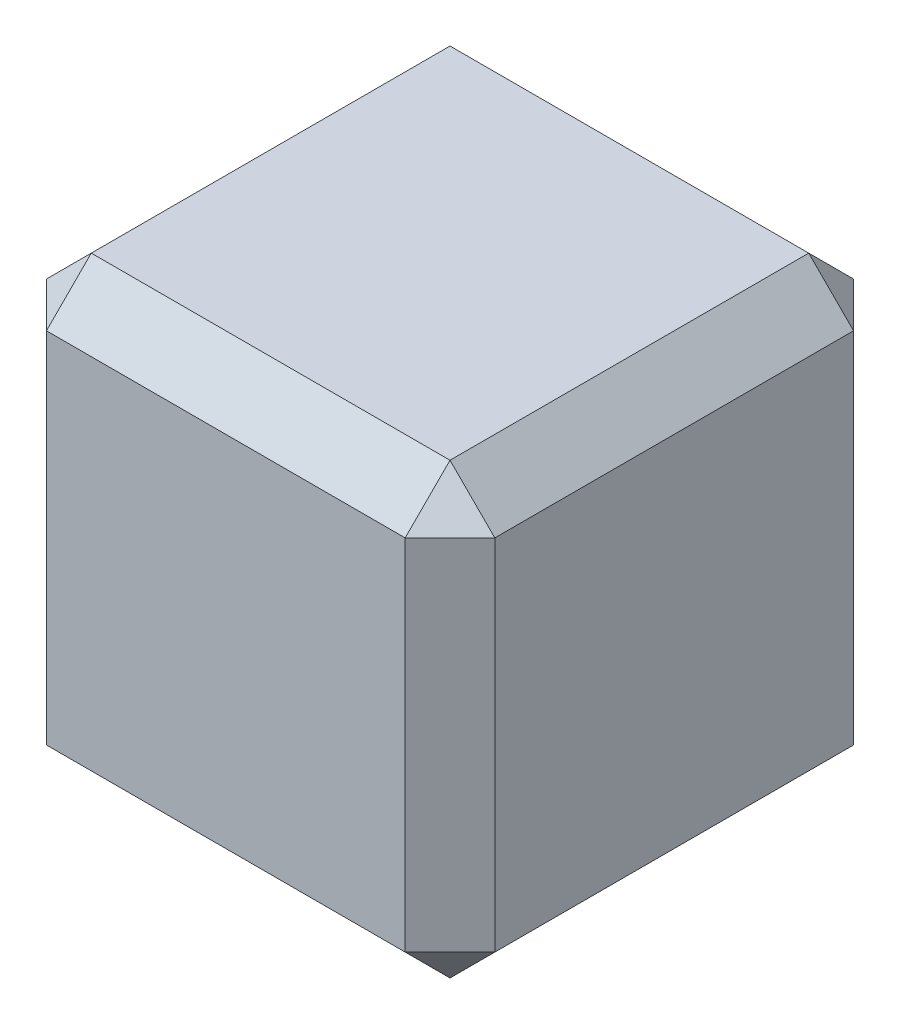
ISO-10303-21;
HEADER;
FILE_DESCRIPTION(('STEP AP214'),'2;1');
FILE_NAME('part.step','',(''),(''),'','','');
FILE_SCHEMA(('AUTOMOTIVE_DESIGN { 1 0 10303 214 1 1 1 1 }'));
ENDSEC;
DATA;
#1=APPLICATION_CONTEXT('core data for automotive mechanical design processes');
#2=APPLICATION_PROTOCOL_DEFINITION('international standard','automotive_design',2000,#1);
#3=PRODUCT_CONTEXT('',#1,'mechanical');
#4=PRODUCT('Part','Part','',(#3));
#5=PRODUCT_RELATED_PRODUCT_CATEGORY('part','',(#4));
#6=PRODUCT_DEFINITION_FORMATION('','',#4);
#7=PRODUCT_DEFINITION_CONTEXT('part definition',#1,'design');
#8=PRODUCT_DEFINITION('design','',#6,#7);
#9=PRODUCT_DEFINITION_SHAPE('','',#8);
#10=(LENGTH_UNIT() NAMED_UNIT(*) SI_UNIT(.MILLI.,.METRE.));
#11=(NAMED_UNIT(*) PLANE_ANGLE_UNIT() SI_UNIT($,.RADIAN.));
#12=(NAMED_UNIT(*) SI_UNIT($,.STERADIAN.) SOLID_ANGLE_UNIT());
#13=UNCERTAINTY_MEASURE_WITH_UNIT(LENGTH_MEASURE(1.E-05),#10,'distance_accuracy_value','');
#14=(GEOMETRIC_REPRESENTATION_CONTEXT(3) GLOBAL_UNCERTAINTY_ASSIGNED_CONTEXT((#13)) GLOBAL_UNIT_ASSIGNED_CONTEXT((#10,
#11,#12)) REPRESENTATION_CONTEXT('',''));
#15=CARTESIAN_POINT('',(0.,0.,0.));
#16=DIRECTION('',(0.,0.,1.));
#17=DIRECTION('',(1.,0.,0.));
#18=AXIS2_PLACEMENT_3D('',#15,#16,#17);
#19=CARTESIAN_POINT('',(120.,88.1395407736635,39.8977546715206));
#20=DIRECTION('',(0.,0.,-1.));
#21=DIRECTION('',(0.,1.,0.));
#22=AXIS2_PLACEMENT_3D('',#19,#20,#21);
#23=PLANE('',#22);
#24=DIRECTION('',(0.,1.,0.));
#25=VECTOR('',#24,1.);
#26=CARTESIAN_POINT('',(108.,88.1395407736635,39.8977546715206));
#27=LINE('',#26,#25);
#28=CARTESIAN_POINT('',(108.,-19.8604592263364,39.8977546715206));
#29=VERTEX_POINT('',#28);
#30=CARTESIAN_POINT('',(108.,76.1395407736635,39.8977546715206));
#31=VERTEX_POINT('',#30);
#32=EDGE_CURVE('E159',#29,#31,#27,.T.);
#33=ORIENTED_EDGE('',*,*,#32,.T.);
#34=DIRECTION('',(-1.,0.,0.));
#35=VECTOR('',#34,1.);
#36=CARTESIAN_POINT('',(120.,76.1395407736635,39.8977546715206));
#37=LINE('',#36,#35);
#38=CARTESIAN_POINT('',(12.,76.1395407736635,39.8977546715206));
#39=VERTEX_POINT('',#38);
#40=EDGE_CURVE('E132',#31,#39,#37,.T.);
#41=ORIENTED_EDGE('',*,*,#40,.T.);
#42=DIRECTION('',(0.,-1.,0.));
#43=VECTOR('',#42,1.);
#44=CARTESIAN_POINT('',(12.,88.1395407736635,39.8977546715206));
#45=LINE('',#44,#43);
#46=CARTESIAN_POINT('',(12.,-19.8604592263364,39.8977546715206));
#47=VERTEX_POINT('',#46);
#48=EDGE_CURVE('E150',#39,#47,#45,.T.);
#49=ORIENTED_EDGE('',*,*,#48,.T.);
#50=DIRECTION('',(1.,0.,0.));
#51=VECTOR('',#50,1.);
#52=CARTESIAN_POINT('',(120.,-19.8604592263364,39.8977546715206));
#53=LINE('',#52,#51);
#54=EDGE_CURVE('E156',#47,#29,#53,.T.);
#55=ORIENTED_EDGE('',*,*,#54,.T.);
#56=EDGE_LOOP('',(#33,#41,#49,#55));
#57=FACE_BOUND('',#56,.T.);
#58=ADVANCED_FACE('F38',(#57),#23,.F.);
#59=CARTESIAN_POINT('',(120.,-31.8604592263365,39.8977546715206));
#60=DIRECTION('',(0.,1.,0.));
#61=DIRECTION('',(0.,0.,1.));
#62=AXIS2_PLACEMENT_3D('',#59,#60,#61);
#63=PLANE('',#62);
#64=DIRECTION('',(1.,0.,0.));
#65=VECTOR('',#64,1.);
#66=CARTESIAN_POINT('',(120.,-31.8604592263365,-68.1022453284794));
#67=LINE('',#66,#65);
#68=CARTESIAN_POINT('',(12.,-31.8604592263365,-68.1022453284794));
#69=VERTEX_POINT('',#68);
#70=CARTESIAN_POINT('',(108.,-31.8604592263365,-68.1022453284794));
#71=VERTEX_POINT('',#70);
#72=EDGE_CURVE('E183',#69,#71,#67,.T.);
#73=ORIENTED_EDGE('',*,*,#72,.T.);
#74=DIRECTION('',(0.,0.,1.));
#75=VECTOR('',#74,1.);
#76=CARTESIAN_POINT('',(108.,-31.8604592263365,39.8977546715206));
#77=LINE('',#76,#75);
#78=CARTESIAN_POINT('',(108.,-31.8604592263365,27.8977546715205));
#79=VERTEX_POINT('',#78);
#80=EDGE_CURVE('E188',#71,#79,#77,.T.);
#81=ORIENTED_EDGE('',*,*,#80,.T.);
#82=DIRECTION('',(-1.,0.,0.));
#83=VECTOR('',#82,1.);
#84=CARTESIAN_POINT('',(120.,-31.8604592263365,27.8977546715205));
#85=LINE('',#84,#83);
#86=CARTESIAN_POINT('',(12.,-31.8604592263365,27.8977546715205));
#87=VERTEX_POINT('',#86);
#88=EDGE_CURVE('E185',#79,#87,#85,.T.);
#89=ORIENTED_EDGE('',*,*,#88,.T.);
#90=DIRECTION('',(0.,0.,-1.));
#91=VECTOR('',#90,1.);
#92=CARTESIAN_POINT('',(12.,-31.8604592263365,39.8977546715206));
#93=LINE('',#92,#91);
#94=EDGE_CURVE('E181',#87,#69,#93,.T.);
#95=ORIENTED_EDGE('',*,*,#94,.T.);
#96=EDGE_LOOP('',(#73,#81,#89,#95));
#97=FACE_BOUND('',#96,.T.);
#98=ADVANCED_FACE('F284',(#97),#63,.F.);
#99=CARTESIAN_POINT('',(120.,88.1395407736635,-80.1022453284794));
#100=DIRECTION('',(0.,0.,1.));
#101=DIRECTION('',(0.,-1.,0.));
#102=AXIS2_PLACEMENT_3D('',#99,#100,#101);
#103=PLANE('',#102);
#104=DIRECTION('',(0.,-1.,0.));
#105=VECTOR('',#104,1.);
#106=CARTESIAN_POINT('',(108.,-31.8604592263365,-80.1022453284794));
#107=LINE('',#106,#105);
#108=CARTESIAN_POINT('',(108.,76.1395407736634,-80.1022453284794));
#109=VERTEX_POINT('',#108);
#110=CARTESIAN_POINT('',(108.,-19.8604592263364,-80.1022453284794));
#111=VERTEX_POINT('',#110);
#112=EDGE_CURVE('E48',#109,#111,#107,.T.);
#113=ORIENTED_EDGE('',*,*,#112,.T.);
#114=DIRECTION('',(-1.,0.,0.));
#115=VECTOR('',#114,1.);
#116=CARTESIAN_POINT('',(120.,-19.8604592263364,-80.1022453284794));
#117=LINE('',#116,#115);
#118=CARTESIAN_POINT('',(12.,-19.8604592263364,-80.1022453284794));
#119=VERTEX_POINT('',#118);
#120=EDGE_CURVE('E11',#111,#119,#117,.T.);
#121=ORIENTED_EDGE('',*,*,#120,.T.);
#122=DIRECTION('',(0.,1.,0.));
#123=VECTOR('',#122,1.);
#124=CARTESIAN_POINT('',(12.,88.1395407736635,-80.1022453284794));
#125=LINE('',#124,#123);
#126=CARTESIAN_POINT('',(12.,76.1395407736634,-80.1022453284794));
#127=VERTEX_POINT('',#126);
#128=EDGE_CURVE('E199',#119,#127,#125,.T.);
#129=ORIENTED_EDGE('',*,*,#128,.T.);
#130=DIRECTION('',(1.,0.,0.));
#131=VECTOR('',#130,1.);
#132=CARTESIAN_POINT('',(120.,76.1395407736634,-80.1022453284794));
#133=LINE('',#132,#131);
#134=EDGE_CURVE('E59',#127,#109,#133,.T.);
#135=ORIENTED_EDGE('',*,*,#134,.T.);
#136=EDGE_LOOP('',(#113,#121,#129,#135));
#137=FACE_BOUND('',#136,.T.);
#138=ADVANCED_FACE('F296',(#137),#103,.F.);
#139=CARTESIAN_POINT('',(120.,88.1395407736635,39.8977546715206));
#140=DIRECTION('',(0.,-1.,0.));
#141=DIRECTION('',(0.,0.,-1.));
#142=AXIS2_PLACEMENT_3D('',#139,#140,#141);
#143=PLANE('',#142);
#144=DIRECTION('',(0.,0.,1.));
#145=VECTOR('',#144,1.);
#146=CARTESIAN_POINT('',(12.,88.1395407736635,39.8977546715206));
#147=LINE('',#146,#145);
#148=CARTESIAN_POINT('',(12.,88.1395407736635,-68.1022453284794));
#149=VERTEX_POINT('',#148);
#150=CARTESIAN_POINT('',(12.,88.1395407736635,27.8977546715205));
#151=VERTEX_POINT('',#150);
#152=EDGE_CURVE('E161',#149,#151,#147,.T.);
#153=ORIENTED_EDGE('',*,*,#152,.T.);
#154=DIRECTION('',(1.,0.,0.));
#155=VECTOR('',#154,1.);
#156=CARTESIAN_POINT('',(120.,88.1395407736635,27.8977546715205));
#157=LINE('',#156,#155);
#158=CARTESIAN_POINT('',(108.,88.1395407736635,27.8977546715205));
#159=VERTEX_POINT('',#158);
#160=EDGE_CURVE('E134',#151,#159,#157,.T.);
#161=ORIENTED_EDGE('',*,*,#160,.T.);
#162=DIRECTION('',(0.,0.,-1.));
#163=VECTOR('',#162,1.);
#164=CARTESIAN_POINT('',(108.,88.1395407736635,-80.1022453284794));
#165=LINE('',#164,#163);
#166=CARTESIAN_POINT('',(108.,88.1395407736635,-68.1022453284794));
#167=VERTEX_POINT('',#166);
#168=EDGE_CURVE('E169',#159,#167,#165,.T.);
#169=ORIENTED_EDGE('',*,*,#168,.T.);
#170=DIRECTION('',(-1.,0.,0.));
#171=VECTOR('',#170,1.);
#172=CARTESIAN_POINT('',(120.,88.1395407736635,-68.1022453284794));
#173=LINE('',#172,#171);
#174=EDGE_CURVE('E163',#167,#149,#173,.T.);
#175=ORIENTED_EDGE('',*,*,#174,.T.);
#176=EDGE_LOOP('',(#153,#161,#169,#175));
#177=FACE_BOUND('',#176,.T.);
#178=ADVANCED_FACE('F312',(#177),#143,.F.);
#179=CARTESIAN_POINT('',(120.,0.,0.));
#180=DIRECTION('',(1.,0.,0.));
#181=DIRECTION('',(0.,0.,-1.));
#182=AXIS2_PLACEMENT_3D('',#179,#180,#181);
#183=PLANE('',#182);
#184=DIRECTION('',(0.,0.,1.));
#185=VECTOR('',#184,1.);
#186=CARTESIAN_POINT('',(120.,76.1395407736635,39.8977546715206));
#187=LINE('',#186,#185);
#188=CARTESIAN_POINT('',(120.,76.1395407736635,-68.1022453284794));
#189=VERTEX_POINT('',#188);
#190=CARTESIAN_POINT('',(120.,76.1395407736635,27.8977546715206));
#191=VERTEX_POINT('',#190);
#192=EDGE_CURVE('E176',#189,#191,#187,.T.);
#193=ORIENTED_EDGE('',*,*,#192,.T.);
#194=DIRECTION('',(0.,-1.,0.));
#195=VECTOR('',#194,1.);
#196=CARTESIAN_POINT('',(120.,-31.8604592263365,27.8977546715205));
#197=LINE('',#196,#195);
#198=CARTESIAN_POINT('',(120.,-19.8604592263364,27.8977546715205));
#199=VERTEX_POINT('',#198);
#200=EDGE_CURVE('E178',#191,#199,#197,.T.);
#201=ORIENTED_EDGE('',*,*,#200,.T.);
#202=DIRECTION('',(0.,0.,-1.));
#203=VECTOR('',#202,1.);
#204=CARTESIAN_POINT('',(120.,-19.8604592263364,-80.1022453284794));
#205=LINE('',#204,#203);
#206=CARTESIAN_POINT('',(120.,-19.8604592263364,-68.1022453284794));
#207=VERTEX_POINT('',#206);
#208=EDGE_CURVE('E174',#199,#207,#205,.T.);
#209=ORIENTED_EDGE('',*,*,#208,.T.);
#210=DIRECTION('',(0.,1.,0.));
#211=VECTOR('',#210,1.);
#212=CARTESIAN_POINT('',(120.,88.1395407736635,-68.1022453284794));
#213=LINE('',#212,#211);
#214=EDGE_CURVE('E172',#207,#189,#213,.T.);
#215=ORIENTED_EDGE('',*,*,#214,.T.);
#216=EDGE_LOOP('',(#193,#201,#209,#215));
#217=FACE_BOUND('',#216,.T.);
#218=ADVANCED_FACE('F275',(#217),#183,.T.);
#219=CARTESIAN_POINT('',(0.,0.,0.));
#220=DIRECTION('',(1.,0.,0.));
#221=DIRECTION('',(0.,0.,-1.));
#222=AXIS2_PLACEMENT_3D('',#219,#220,#221);
#223=PLANE('',#222);
#224=DIRECTION('',(0.,0.,1.));
#225=VECTOR('',#224,1.);
#226=CARTESIAN_POINT('',(0.,-19.8604592263364,0.));
#227=LINE('',#226,#225);
#228=CARTESIAN_POINT('',(0.,-19.8604592263364,-68.1022453284793));
#229=VERTEX_POINT('',#228);
#230=CARTESIAN_POINT('',(0.,-19.8604592263364,27.8977546715205));
#231=VERTEX_POINT('',#230);
#232=EDGE_CURVE('E190',#229,#231,#227,.T.);
#233=ORIENTED_EDGE('',*,*,#232,.T.);
#234=DIRECTION('',(0.,1.,0.));
#235=VECTOR('',#234,1.);
#236=CARTESIAN_POINT('',(0.,0.,27.8977546715205));
#237=LINE('',#236,#235);
#238=CARTESIAN_POINT('',(0.,76.1395407736634,27.8977546715205));
#239=VERTEX_POINT('',#238);
#240=EDGE_CURVE('E196',#231,#239,#237,.T.);
#241=ORIENTED_EDGE('',*,*,#240,.T.);
#242=DIRECTION('',(0.,0.,-1.));
#243=VECTOR('',#242,1.);
#244=CARTESIAN_POINT('',(0.,76.1395407736634,0.));
#245=LINE('',#244,#243);
#246=CARTESIAN_POINT('',(0.,76.1395407736634,-68.1022453284793));
#247=VERTEX_POINT('',#246);
#248=EDGE_CURVE('E194',#239,#247,#245,.T.);
#249=ORIENTED_EDGE('',*,*,#248,.T.);
#250=DIRECTION('',(0.,-1.,0.));
#251=VECTOR('',#250,1.);
#252=CARTESIAN_POINT('',(0.,0.,-68.1022453284793));
#253=LINE('',#252,#251);
#254=EDGE_CURVE('E192',#247,#229,#253,.T.);
#255=ORIENTED_EDGE('',*,*,#254,.T.);
#256=EDGE_LOOP('',(#233,#241,#249,#255));
#257=FACE_BOUND('',#256,.T.);
#258=ADVANCED_FACE('F430',(#257),#223,.F.);
#259=CARTESIAN_POINT('',(120.,-19.8604592263364,-80.1022453284794));
#260=DIRECTION('',(0.,0.707106781186546,0.707106781186549));
#261=DIRECTION('',(-1.,0.,0.));
#262=AXIS2_PLACEMENT_3D('',#259,#260,#261);
#263=PLANE('',#262);
#264=DIRECTION('',(0.,-0.707106781186549,0.707106781186546));
#265=VECTOR('',#264,1.);
#266=CARTESIAN_POINT('',(108.,-31.8604592263365,-68.1022453284794));
#267=LINE('',#266,#265);
#268=EDGE_CURVE('E43',#71,#111,#267,.F.);
#269=ORIENTED_EDGE('',*,*,#268,.F.);
#270=ORIENTED_EDGE('',*,*,#72,.F.);
#271=DIRECTION('',(0.,0.707106781186549,-0.707106781186546));
#272=VECTOR('',#271,1.);
#273=CARTESIAN_POINT('',(12.,-19.8604592263364,-80.1022453284794));
#274=LINE('',#273,#272);
#275=EDGE_CURVE('E253',#119,#69,#274,.F.);
#276=ORIENTED_EDGE('',*,*,#275,.F.);
#277=ORIENTED_EDGE('',*,*,#120,.F.);
#278=EDGE_LOOP('',(#269,#270,#276,#277));
#279=FACE_BOUND('',#278,.T.);
#280=ADVANCED_FACE('F41',(#279),#263,.F.);
#281=CARTESIAN_POINT('',(108.,-31.8604592263365,-68.1022453284794));
#282=DIRECTION('',(0.577350269189626,-0.577350269189623,-0.577350269189628));
#283=DIRECTION('',(-0.707106781186549,0.,-0.707106781186546));
#284=AXIS2_PLACEMENT_3D('',#281,#282,#283);
#285=PLANE('',#284);
#286=DIRECTION('',(-0.707106781186546,-0.707106781186549,0.));
#287=VECTOR('',#286,1.);
#288=CARTESIAN_POINT('',(108.,-31.8604592263365,-68.1022453284794));
#289=LINE('',#288,#287);
#290=EDGE_CURVE('E248',#71,#207,#289,.F.);
#291=ORIENTED_EDGE('',*,*,#290,.F.);
#292=ORIENTED_EDGE('',*,*,#268,.T.);
#293=DIRECTION('',(0.707106781186549,0.,0.707106781186546));
#294=VECTOR('',#293,1.);
#295=CARTESIAN_POINT('',(114.,-19.8604592263364,-74.1022453284794));
#296=LINE('',#295,#294);
#297=EDGE_CURVE('E251',#207,#111,#296,.F.);
#298=ORIENTED_EDGE('',*,*,#297,.F.);
#299=EDGE_LOOP('',(#291,#292,#298));
#300=FACE_BOUND('',#299,.T.);
#301=ADVANCED_FACE('F264',(#300),#285,.T.);
#302=CARTESIAN_POINT('',(12.,-19.8604592263364,-80.1022453284794));
#303=DIRECTION('',(-0.577350269189629,-0.577350269189623,-0.577350269189625));
#304=DIRECTION('',(-0.707106781186545,0.,0.70710678118655));
#305=AXIS2_PLACEMENT_3D('',#302,#303,#304);
#306=PLANE('',#305);
#307=DIRECTION('',(-0.707106781186546,0.,0.707106781186549));
#308=VECTOR('',#307,1.);
#309=CARTESIAN_POINT('',(12.,-19.8604592263364,-80.1022453284794));
#310=LINE('',#309,#308);
#311=EDGE_CURVE('E242',#119,#229,#310,.T.);
#312=ORIENTED_EDGE('',*,*,#311,.F.);
#313=ORIENTED_EDGE('',*,*,#275,.T.);
#314=DIRECTION('',(0.707106781186546,-0.707106781186549,0.));
#315=VECTOR('',#314,1.);
#316=CARTESIAN_POINT('',(6.00000000000003,-25.8604592263364,-68.1022453284793));
#317=LINE('',#316,#315);
#318=EDGE_CURVE('E245',#229,#69,#317,.T.);
#319=ORIENTED_EDGE('',*,*,#318,.F.);
#320=EDGE_LOOP('',(#312,#313,#319));
#321=FACE_BOUND('',#320,.T.);
#322=ADVANCED_FACE('F420',(#321),#306,.T.);
#323=CARTESIAN_POINT('',(120.,0.,-68.1022453284794));
#324=DIRECTION('',(0.707106781186546,0.,-0.707106781186549));
#325=DIRECTION('',(0.,-1.,0.));
#326=AXIS2_PLACEMENT_3D('',#323,#324,#325);
#327=PLANE('',#326);
#328=ORIENTED_EDGE('',*,*,#297,.T.);
#329=ORIENTED_EDGE('',*,*,#112,.F.);
#330=DIRECTION('',(-0.707106781186549,0.,-0.707106781186546));
#331=VECTOR('',#330,1.);
#332=CARTESIAN_POINT('',(114.,76.1395407736635,-74.1022453284794));
#333=LINE('',#332,#331);
#334=EDGE_CURVE('E236',#189,#109,#333,.T.);
#335=ORIENTED_EDGE('',*,*,#334,.F.);
#336=ORIENTED_EDGE('',*,*,#214,.F.);
#337=EDGE_LOOP('',(#328,#329,#335,#336));
#338=FACE_BOUND('',#337,.T.);
#339=ADVANCED_FACE('F270',(#338),#327,.T.);
#340=CARTESIAN_POINT('',(120.,-19.8604592263364,0.));
#341=DIRECTION('',(0.707106781186549,-0.707106781186546,0.));
#342=DIRECTION('',(0.,0.,1.));
#343=AXIS2_PLACEMENT_3D('',#340,#341,#342);
#344=PLANE('',#343);
#345=ORIENTED_EDGE('',*,*,#290,.T.);
#346=ORIENTED_EDGE('',*,*,#208,.F.);
#347=DIRECTION('',(0.707106781186546,0.707106781186549,0.));
#348=VECTOR('',#347,1.);
#349=CARTESIAN_POINT('',(120.,-19.8604592263364,27.8977546715205));
#350=LINE('',#349,#348);
#351=EDGE_CURVE('E233',#79,#199,#350,.T.);
#352=ORIENTED_EDGE('',*,*,#351,.F.);
#353=ORIENTED_EDGE('',*,*,#80,.F.);
#354=EDGE_LOOP('',(#345,#346,#352,#353));
#355=FACE_BOUND('',#354,.T.);
#356=ADVANCED_FACE('F281',(#355),#344,.T.);
#357=CARTESIAN_POINT('',(120.,-31.8604592263365,27.8977546715205));
#358=DIRECTION('',(0.,0.707106781186546,-0.707106781186549));
#359=DIRECTION('',(-1.,0.,0.));
#360=AXIS2_PLACEMENT_3D('',#357,#358,#359);
#361=PLANE('',#360);
#362=DIRECTION('',(0.,-0.707106781186549,-0.707106781186546));
#363=VECTOR('',#362,1.);
#364=CARTESIAN_POINT('',(12.,-31.8604592263365,27.8977546715205));
#365=LINE('',#364,#363);
#366=EDGE_CURVE('E227',#87,#47,#365,.F.);
#367=ORIENTED_EDGE('',*,*,#366,.F.);
#368=ORIENTED_EDGE('',*,*,#88,.F.);
#369=DIRECTION('',(0.,0.707106781186549,0.707106781186546));
#370=VECTOR('',#369,1.);
#371=CARTESIAN_POINT('',(108.,-25.8604592263364,33.8977546715206));
#372=LINE('',#371,#370);
#373=EDGE_CURVE('E230',#29,#79,#372,.F.);
#374=ORIENTED_EDGE('',*,*,#373,.F.);
#375=ORIENTED_EDGE('',*,*,#54,.F.);
#376=EDGE_LOOP('',(#367,#368,#374,#375));
#377=FACE_BOUND('',#376,.T.);
#378=ADVANCED_FACE('F288',(#377),#361,.F.);
#379=CARTESIAN_POINT('',(12.,-31.8604592263365,39.8977546715206));
#380=DIRECTION('',(0.707106781186549,0.707106781186546,0.));
#381=DIRECTION('',(0.,0.,-1.));
#382=AXIS2_PLACEMENT_3D('',#379,#380,#381);
#383=PLANE('',#382);
#384=ORIENTED_EDGE('',*,*,#318,.T.);
#385=ORIENTED_EDGE('',*,*,#94,.F.);
#386=DIRECTION('',(-0.707106781186546,0.707106781186549,0.));
#387=VECTOR('',#386,1.);
#388=CARTESIAN_POINT('',(12.,-31.8604592263365,27.8977546715205));
#389=LINE('',#388,#387);
#390=EDGE_CURVE('E225',#231,#87,#389,.F.);
#391=ORIENTED_EDGE('',*,*,#390,.F.);
#392=ORIENTED_EDGE('',*,*,#232,.F.);
#393=EDGE_LOOP('',(#384,#385,#391,#392));
#394=FACE_BOUND('',#393,.T.);
#395=ADVANCED_FACE('F294',(#394),#383,.F.);
#396=CARTESIAN_POINT('',(12.,88.1395407736635,-80.1022453284794));
#397=DIRECTION('',(0.707106781186549,0.,0.707106781186546));
#398=DIRECTION('',(0.,1.,0.));
#399=AXIS2_PLACEMENT_3D('',#396,#397,#398);
#400=PLANE('',#399);
#401=ORIENTED_EDGE('',*,*,#311,.T.);
#402=ORIENTED_EDGE('',*,*,#254,.F.);
#403=DIRECTION('',(0.707106781186546,0.,-0.707106781186549));
#404=VECTOR('',#403,1.);
#405=CARTESIAN_POINT('',(6.00000000000002,76.1395407736634,-74.1022453284794));
#406=LINE('',#405,#404);
#407=EDGE_CURVE('E222',#127,#247,#406,.F.);
#408=ORIENTED_EDGE('',*,*,#407,.F.);
#409=ORIENTED_EDGE('',*,*,#128,.F.);
#410=EDGE_LOOP('',(#401,#402,#408,#409));
#411=FACE_BOUND('',#410,.T.);
#412=ADVANCED_FACE('F305',(#411),#400,.F.);
#413=CARTESIAN_POINT('',(120.,88.1395407736635,-68.1022453284794));
#414=DIRECTION('',(0.,-0.707106781186546,0.707106781186549));
#415=DIRECTION('',(-1.,0.,0.));
#416=AXIS2_PLACEMENT_3D('',#413,#414,#415);
#417=PLANE('',#416);
#418=DIRECTION('',(0.,-0.707106781186549,-0.707106781186546));
#419=VECTOR('',#418,1.);
#420=CARTESIAN_POINT('',(108.,88.1395407736635,-68.1022453284794));
#421=LINE('',#420,#419);
#422=EDGE_CURVE('E239',#109,#167,#421,.F.);
#423=ORIENTED_EDGE('',*,*,#422,.F.);
#424=ORIENTED_EDGE('',*,*,#134,.F.);
#425=DIRECTION('',(0.,0.707106781186549,0.707106781186546));
#426=VECTOR('',#425,1.);
#427=CARTESIAN_POINT('',(12.,88.1395407736635,-68.1022453284794));
#428=LINE('',#427,#426);
#429=EDGE_CURVE('E219',#149,#127,#428,.F.);
#430=ORIENTED_EDGE('',*,*,#429,.F.);
#431=ORIENTED_EDGE('',*,*,#174,.F.);
#432=EDGE_LOOP('',(#423,#424,#430,#431));
#433=FACE_BOUND('',#432,.T.);
#434=ADVANCED_FACE('F301',(#433),#417,.F.);
#435=CARTESIAN_POINT('',(108.,88.1395407736635,-68.1022453284794));
#436=DIRECTION('',(0.577350269189623,0.577350269189626,-0.577350269189628));
#437=DIRECTION('',(0.,0.707106781186549,0.707106781186546));
#438=AXIS2_PLACEMENT_3D('',#435,#436,#437);
#439=PLANE('',#438);
#440=ORIENTED_EDGE('',*,*,#334,.T.);
#441=ORIENTED_EDGE('',*,*,#422,.T.);
#442=DIRECTION('',(0.707106781186549,-0.707106781186546,0.));
#443=VECTOR('',#442,1.);
#444=CARTESIAN_POINT('',(108.,88.1395407736635,-68.1022453284794));
#445=LINE('',#444,#443);
#446=EDGE_CURVE('E216',#189,#167,#445,.F.);
#447=ORIENTED_EDGE('',*,*,#446,.F.);
#448=EDGE_LOOP('',(#440,#441,#447));
#449=FACE_BOUND('',#448,.T.);
#450=ADVANCED_FACE('F315',(#449),#439,.T.);
#451=CARTESIAN_POINT('',(120.,-19.8604592263364,27.8977546715205));
#452=DIRECTION('',(0.577350269189626,-0.577350269189623,0.577350269189629));
#453=DIRECTION('',(0.707106781186549,0.,-0.707106781186546));
#454=AXIS2_PLACEMENT_3D('',#451,#452,#453);
#455=PLANE('',#454);
#456=ORIENTED_EDGE('',*,*,#373,.T.);
#457=ORIENTED_EDGE('',*,*,#351,.T.);
#458=DIRECTION('',(-0.707106781186549,0.,0.707106781186546));
#459=VECTOR('',#458,1.);
#460=CARTESIAN_POINT('',(120.,-19.8604592263364,27.8977546715205));
#461=LINE('',#460,#459);
#462=EDGE_CURVE('E214',#29,#199,#461,.F.);
#463=ORIENTED_EDGE('',*,*,#462,.F.);
#464=EDGE_LOOP('',(#456,#457,#463));
#465=FACE_BOUND('',#464,.T.);
#466=ADVANCED_FACE('F325',(#465),#455,.T.);
#467=CARTESIAN_POINT('',(12.,-31.8604592263365,27.8977546715205));
#468=DIRECTION('',(-0.577350269189628,-0.577350269189623,0.577350269189626));
#469=DIRECTION('',(0.707106781186546,0.,0.707106781186549));
#470=AXIS2_PLACEMENT_3D('',#467,#468,#469);
#471=PLANE('',#470);
#472=ORIENTED_EDGE('',*,*,#390,.T.);
#473=ORIENTED_EDGE('',*,*,#366,.T.);
#474=DIRECTION('',(0.707106781186546,0.,0.707106781186549));
#475=VECTOR('',#474,1.);
#476=CARTESIAN_POINT('',(6.00000000000002,-19.8604592263364,33.8977546715205));
#477=LINE('',#476,#475);
#478=EDGE_CURVE('E153',#231,#47,#477,.T.);
#479=ORIENTED_EDGE('',*,*,#478,.F.);
#480=EDGE_LOOP('',(#472,#473,#479));
#481=FACE_BOUND('',#480,.T.);
#482=ADVANCED_FACE('F327',(#481),#471,.T.);
#483=CARTESIAN_POINT('',(12.,88.1395407736635,-68.1022453284794));
#484=DIRECTION('',(-0.577350269189629,0.577350269189623,-0.577350269189626));
#485=DIRECTION('',(-0.707106781186545,0.,0.70710678118655));
#486=AXIS2_PLACEMENT_3D('',#483,#484,#485);
#487=PLANE('',#486);
#488=ORIENTED_EDGE('',*,*,#429,.T.);
#489=ORIENTED_EDGE('',*,*,#407,.T.);
#490=DIRECTION('',(-0.707106781186546,-0.707106781186549,0.));
#491=VECTOR('',#490,1.);
#492=CARTESIAN_POINT('',(12.,88.1395407736635,-68.1022453284794));
#493=LINE('',#492,#491);
#494=EDGE_CURVE('E210',#149,#247,#493,.T.);
#495=ORIENTED_EDGE('',*,*,#494,.F.);
#496=EDGE_LOOP('',(#488,#489,#495));
#497=FACE_BOUND('',#496,.T.);
#498=ADVANCED_FACE('F307',(#497),#487,.T.);
#499=CARTESIAN_POINT('',(120.,76.1395407736635,0.));
#500=DIRECTION('',(0.707106781186546,0.707106781186549,0.));
#501=DIRECTION('',(0.,0.,-1.));
#502=AXIS2_PLACEMENT_3D('',#499,#500,#501);
#503=PLANE('',#502);
#504=ORIENTED_EDGE('',*,*,#446,.T.);
#505=ORIENTED_EDGE('',*,*,#168,.F.);
#506=DIRECTION('',(-0.707106781186549,0.707106781186546,0.));
#507=VECTOR('',#506,1.);
#508=CARTESIAN_POINT('',(108.,88.1395407736635,27.8977546715205));
#509=LINE('',#508,#507);
#510=EDGE_CURVE('E207',#191,#159,#509,.T.);
#511=ORIENTED_EDGE('',*,*,#510,.F.);
#512=ORIENTED_EDGE('',*,*,#192,.F.);
#513=EDGE_LOOP('',(#504,#505,#511,#512));
#514=FACE_BOUND('',#513,.T.);
#515=ADVANCED_FACE('F317',(#514),#503,.T.);
#516=CARTESIAN_POINT('',(120.,0.,27.8977546715205));
#517=DIRECTION('',(0.707106781186546,0.,0.707106781186549));
#518=DIRECTION('',(0.,1.,0.));
#519=AXIS2_PLACEMENT_3D('',#516,#517,#518);
#520=PLANE('',#519);
#521=ORIENTED_EDGE('',*,*,#462,.T.);
#522=ORIENTED_EDGE('',*,*,#200,.F.);
#523=DIRECTION('',(0.707106781186549,0.,-0.707106781186546));
#524=VECTOR('',#523,1.);
#525=CARTESIAN_POINT('',(114.,76.1395407736635,33.8977546715206));
#526=LINE('',#525,#524);
#527=EDGE_CURVE('E147',#31,#191,#526,.T.);
#528=ORIENTED_EDGE('',*,*,#527,.F.);
#529=ORIENTED_EDGE('',*,*,#32,.F.);
#530=EDGE_LOOP('',(#521,#522,#528,#529));
#531=FACE_BOUND('',#530,.T.);
#532=ADVANCED_FACE('F323',(#531),#520,.T.);
#533=CARTESIAN_POINT('',(12.,88.1395407736635,39.8977546715206));
#534=DIRECTION('',(0.707106781186549,0.,-0.707106781186546));
#535=DIRECTION('',(0.,-1.,0.));
#536=AXIS2_PLACEMENT_3D('',#533,#534,#535);
#537=PLANE('',#536);
#538=ORIENTED_EDGE('',*,*,#478,.T.);
#539=ORIENTED_EDGE('',*,*,#48,.F.);
#540=DIRECTION('',(-0.707106781186546,0.,-0.707106781186549));
#541=VECTOR('',#540,1.);
#542=CARTESIAN_POINT('',(12.,76.1395407736635,39.8977546715206));
#543=LINE('',#542,#541);
#544=EDGE_CURVE('E139',#239,#39,#543,.F.);
#545=ORIENTED_EDGE('',*,*,#544,.F.);
#546=ORIENTED_EDGE('',*,*,#240,.F.);
#547=EDGE_LOOP('',(#538,#539,#545,#546));
#548=FACE_BOUND('',#547,.T.);
#549=ADVANCED_FACE('F151',(#548),#537,.F.);
#550=CARTESIAN_POINT('',(12.,88.1395407736635,39.8977546715206));
#551=DIRECTION('',(0.707106781186549,-0.707106781186546,0.));
#552=DIRECTION('',(0.,0.,1.));
#553=AXIS2_PLACEMENT_3D('',#550,#551,#552);
#554=PLANE('',#553);
#555=ORIENTED_EDGE('',*,*,#494,.T.);
#556=ORIENTED_EDGE('',*,*,#248,.F.);
#557=DIRECTION('',(0.707106781186546,0.707106781186549,0.));
#558=VECTOR('',#557,1.);
#559=CARTESIAN_POINT('',(6.00000000000002,82.1395407736635,27.8977546715205));
#560=LINE('',#559,#558);
#561=EDGE_CURVE('E143',#151,#239,#560,.F.);
#562=ORIENTED_EDGE('',*,*,#561,.F.);
#563=ORIENTED_EDGE('',*,*,#152,.F.);
#564=EDGE_LOOP('',(#555,#556,#562,#563));
#565=FACE_BOUND('',#564,.T.);
#566=ADVANCED_FACE('F310',(#565),#554,.F.);
#567=CARTESIAN_POINT('',(108.,88.1395407736635,27.8977546715205));
#568=DIRECTION('',(0.577350269189623,0.577350269189629,0.577350269189626));
#569=DIRECTION('',(0.,-0.707106781186546,0.707106781186549));
#570=AXIS2_PLACEMENT_3D('',#567,#568,#569);
#571=PLANE('',#570);
#572=ORIENTED_EDGE('',*,*,#527,.T.);
#573=ORIENTED_EDGE('',*,*,#510,.T.);
#574=DIRECTION('',(0.,0.707106781186546,-0.707106781186549));
#575=VECTOR('',#574,1.);
#576=CARTESIAN_POINT('',(108.,88.1395407736635,27.8977546715205));
#577=LINE('',#576,#575);
#578=EDGE_CURVE('E136',#31,#159,#577,.T.);
#579=ORIENTED_EDGE('',*,*,#578,.F.);
#580=EDGE_LOOP('',(#572,#573,#579));
#581=FACE_BOUND('',#580,.T.);
#582=ADVANCED_FACE('F321',(#581),#571,.T.);
#583=CARTESIAN_POINT('',(12.,76.1395407736635,39.8977546715206));
#584=DIRECTION('',(-0.577350269189629,0.577350269189626,0.577350269189623));
#585=DIRECTION('',(-0.707106781186546,-0.707106781186549,0.));
#586=AXIS2_PLACEMENT_3D('',#583,#584,#585);
#587=PLANE('',#586);
#588=ORIENTED_EDGE('',*,*,#561,.T.);
#589=ORIENTED_EDGE('',*,*,#544,.T.);
#590=DIRECTION('',(0.,-0.707106781186546,0.707106781186549));
#591=VECTOR('',#590,1.);
#592=CARTESIAN_POINT('',(12.,76.1395407736635,39.8977546715206));
#593=LINE('',#592,#591);
#594=EDGE_CURVE('E128',#151,#39,#593,.T.);
#595=ORIENTED_EDGE('',*,*,#594,.F.);
#596=EDGE_LOOP('',(#588,#589,#595));
#597=FACE_BOUND('',#596,.T.);
#598=ADVANCED_FACE('F141',(#597),#587,.T.);
#599=CARTESIAN_POINT('',(120.,76.1395407736635,39.8977546715206));
#600=DIRECTION('',(0.,-0.707106781186549,-0.707106781186546));
#601=DIRECTION('',(-1.,0.,0.));
#602=AXIS2_PLACEMENT_3D('',#599,#600,#601);
#603=PLANE('',#602);
#604=ORIENTED_EDGE('',*,*,#578,.T.);
#605=ORIENTED_EDGE('',*,*,#160,.F.);
#606=ORIENTED_EDGE('',*,*,#594,.T.);
#607=ORIENTED_EDGE('',*,*,#40,.F.);
#608=EDGE_LOOP('',(#604,#605,#606,#607));
#609=FACE_BOUND('',#608,.T.);
#610=ADVANCED_FACE('F130',(#609),#603,.F.);
#611=CLOSED_SHELL('',(#58,#98,#138,#178,#218,#258,#280,#301,#322,#339,#356,#378,#395,#412,#434,
#450,#466,#482,#498,#515,#532,#549,#566,#582,#598,#610));
#612=MANIFOLD_SOLID_BREP('B2',#611);
#613=ADVANCED_BREP_SHAPE_REPRESENTATION('',(#18,#612),#14);
#614=SHAPE_DEFINITION_REPRESENTATION(#9,#613);
ENDSEC;
END-ISO-10303-21;
